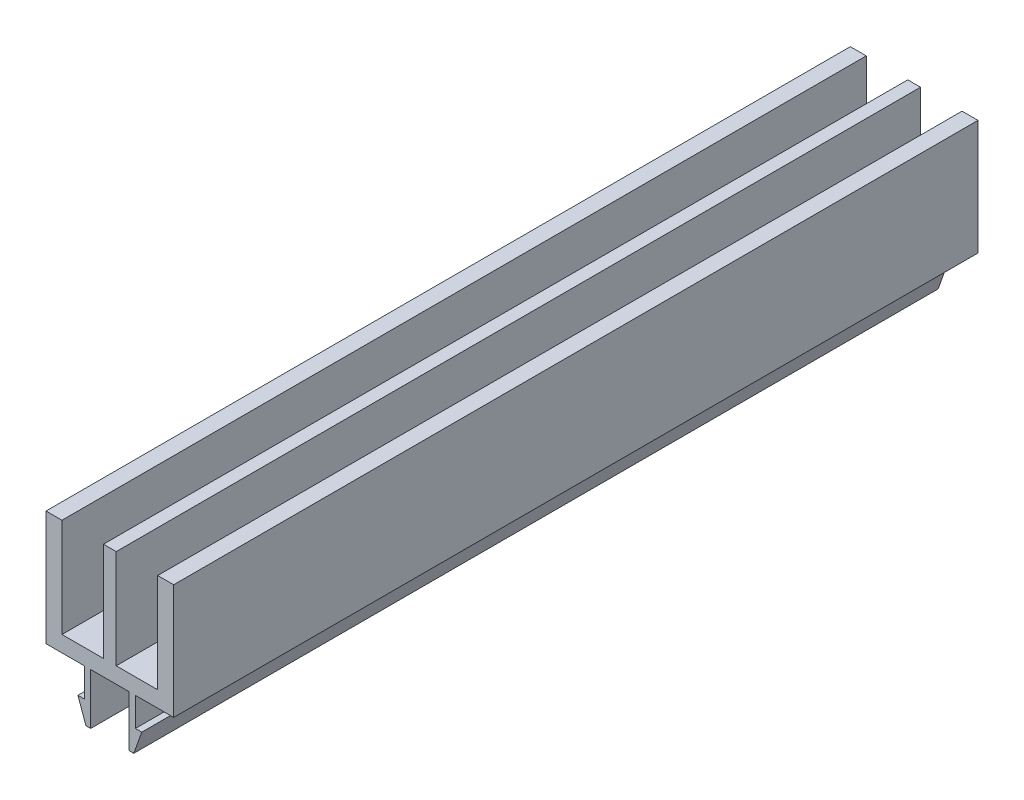
ISO-10303-21;
HEADER;
FILE_DESCRIPTION(('STEP AP214'),'2;1');
FILE_NAME('part.step','',(''),(''),'','','');
FILE_SCHEMA(('AUTOMOTIVE_DESIGN { 1 0 10303 214 1 1 1 1 }'));
ENDSEC;
DATA;
#1=APPLICATION_CONTEXT('core data for automotive mechanical design processes');
#2=APPLICATION_PROTOCOL_DEFINITION('international standard','automotive_design',2000,#1);
#3=PRODUCT_CONTEXT('',#1,'mechanical');
#4=PRODUCT('Part','Part','',(#3));
#5=PRODUCT_RELATED_PRODUCT_CATEGORY('part','',(#4));
#6=PRODUCT_DEFINITION_FORMATION('','',#4);
#7=PRODUCT_DEFINITION_CONTEXT('part definition',#1,'design');
#8=PRODUCT_DEFINITION('design','',#6,#7);
#9=PRODUCT_DEFINITION_SHAPE('','',#8);
#10=(LENGTH_UNIT() NAMED_UNIT(*) SI_UNIT(.MILLI.,.METRE.));
#11=(NAMED_UNIT(*) PLANE_ANGLE_UNIT() SI_UNIT($,.RADIAN.));
#12=(NAMED_UNIT(*) SI_UNIT($,.STERADIAN.) SOLID_ANGLE_UNIT());
#13=UNCERTAINTY_MEASURE_WITH_UNIT(LENGTH_MEASURE(1.E-05),#10,'distance_accuracy_value','');
#14=(GEOMETRIC_REPRESENTATION_CONTEXT(3) GLOBAL_UNCERTAINTY_ASSIGNED_CONTEXT((#13)) GLOBAL_UNIT_ASSIGNED_CONTEXT((#10,
#11,#12)) REPRESENTATION_CONTEXT('',''));
#15=CARTESIAN_POINT('',(0.,0.,0.));
#16=DIRECTION('',(0.,0.,1.));
#17=DIRECTION('',(1.,0.,0.));
#18=AXIS2_PLACEMENT_3D('',#15,#16,#17);
#19=CARTESIAN_POINT('',(-1.,17.9999999975,-76.));
#20=DIRECTION('',(-1.,0.,0.));
#21=DIRECTION('',(0.,-1.,0.));
#22=AXIS2_PLACEMENT_3D('',#19,#20,#21);
#23=PLANE('',#22);
#24=DIRECTION('',(0.,-1.,0.));
#25=VECTOR('',#24,1.);
#26=CARTESIAN_POINT('',(-1.,17.9999999975,50.));
#27=LINE('',#26,#25);
#28=CARTESIAN_POINT('',(-1.,17.9999999975,50.));
#29=VERTEX_POINT('',#28);
#30=CARTESIAN_POINT('',(-1.,2.4999999995,50.));
#31=VERTEX_POINT('',#30);
#32=EDGE_CURVE('E226',#29,#31,#27,.T.);
#33=ORIENTED_EDGE('',*,*,#32,.F.);
#34=DIRECTION('',(0.,0.,1.));
#35=VECTOR('',#34,1.);
#36=CARTESIAN_POINT('',(-1.,17.9999999975,-76.));
#37=LINE('',#36,#35);
#38=CARTESIAN_POINT('',(-1.,17.9999999975,-76.));
#39=VERTEX_POINT('',#38);
#40=EDGE_CURVE('E11',#39,#29,#37,.T.);
#41=ORIENTED_EDGE('',*,*,#40,.F.);
#42=DIRECTION('',(0.,-1.,0.));
#43=VECTOR('',#42,1.);
#44=CARTESIAN_POINT('',(-1.,17.9999999975,-76.));
#45=LINE('',#44,#43);
#46=CARTESIAN_POINT('',(-1.,2.4999999995,-76.));
#47=VERTEX_POINT('',#46);
#48=EDGE_CURVE('E294',#39,#47,#45,.T.);
#49=ORIENTED_EDGE('',*,*,#48,.T.);
#50=DIRECTION('',(0.,0.,1.));
#51=VECTOR('',#50,1.);
#52=CARTESIAN_POINT('',(-1.,2.4999999995,-76.));
#53=LINE('',#52,#51);
#54=EDGE_CURVE('E36',#47,#31,#53,.T.);
#55=ORIENTED_EDGE('',*,*,#54,.T.);
#56=EDGE_LOOP('',(#33,#41,#49,#55));
#57=FACE_BOUND('',#56,.T.);
#58=ADVANCED_FACE('F33',(#57),#23,.T.);
#59=CARTESIAN_POINT('',(0.999999999999998,17.9999999975,-76.));
#60=DIRECTION('',(0.,1.,0.));
#61=DIRECTION('',(0.,0.,1.));
#62=AXIS2_PLACEMENT_3D('',#59,#60,#61);
#63=PLANE('',#62);
#64=DIRECTION('',(-1.,0.,0.));
#65=VECTOR('',#64,1.);
#66=CARTESIAN_POINT('',(0.999999999999998,17.9999999975,50.));
#67=LINE('',#66,#65);
#68=CARTESIAN_POINT('',(0.999999999999998,17.9999999975,50.));
#69=VERTEX_POINT('',#68);
#70=EDGE_CURVE('E292',#69,#29,#67,.T.);
#71=ORIENTED_EDGE('',*,*,#70,.F.);
#72=DIRECTION('',(0.,0.,1.));
#73=VECTOR('',#72,1.);
#74=CARTESIAN_POINT('',(0.999999999999998,17.9999999975,-76.));
#75=LINE('',#74,#73);
#76=CARTESIAN_POINT('',(0.999999999999998,17.9999999975,-76.));
#77=VERTEX_POINT('',#76);
#78=EDGE_CURVE('E42',#77,#69,#75,.T.);
#79=ORIENTED_EDGE('',*,*,#78,.F.);
#80=DIRECTION('',(-1.,0.,0.));
#81=VECTOR('',#80,1.);
#82=CARTESIAN_POINT('',(0.999999999999998,17.9999999975,-76.));
#83=LINE('',#82,#81);
#84=EDGE_CURVE('E216',#77,#39,#83,.T.);
#85=ORIENTED_EDGE('',*,*,#84,.T.);
#86=ORIENTED_EDGE('',*,*,#40,.T.);
#87=EDGE_LOOP('',(#71,#79,#85,#86));
#88=FACE_BOUND('',#87,.T.);
#89=ADVANCED_FACE('F338',(#88),#63,.T.);
#90=CARTESIAN_POINT('',(0.999999999999998,2.4999999995,-76.));
#91=DIRECTION('',(1.,0.,0.));
#92=DIRECTION('',(0.,0.,-1.));
#93=AXIS2_PLACEMENT_3D('',#90,#91,#92);
#94=PLANE('',#93);
#95=DIRECTION('',(0.,1.,0.));
#96=VECTOR('',#95,1.);
#97=CARTESIAN_POINT('',(0.999999999999998,2.4999999995,50.));
#98=LINE('',#97,#96);
#99=CARTESIAN_POINT('',(0.999999999999998,2.4999999995,50.));
#100=VERTEX_POINT('',#99);
#101=EDGE_CURVE('E203',#100,#69,#98,.T.);
#102=ORIENTED_EDGE('',*,*,#101,.F.);
#103=DIRECTION('',(0.,0.,1.));
#104=VECTOR('',#103,1.);
#105=CARTESIAN_POINT('',(0.999999999999998,2.4999999995,-76.));
#106=LINE('',#105,#104);
#107=CARTESIAN_POINT('',(0.999999999999998,2.4999999995,-76.));
#108=VERTEX_POINT('',#107);
#109=EDGE_CURVE('E198',#108,#100,#106,.T.);
#110=ORIENTED_EDGE('',*,*,#109,.F.);
#111=DIRECTION('',(0.,1.,0.));
#112=VECTOR('',#111,1.);
#113=CARTESIAN_POINT('',(0.999999999999998,2.4999999995,-76.));
#114=LINE('',#113,#112);
#115=EDGE_CURVE('E201',#108,#77,#114,.T.);
#116=ORIENTED_EDGE('',*,*,#115,.T.);
#117=ORIENTED_EDGE('',*,*,#78,.T.);
#118=EDGE_LOOP('',(#102,#110,#116,#117));
#119=FACE_BOUND('',#118,.T.);
#120=ADVANCED_FACE('F200',(#119),#94,.T.);
#121=CARTESIAN_POINT('',(7.5,2.4999999995,-76.));
#122=DIRECTION('',(0.,1.,0.));
#123=DIRECTION('',(-1.,0.,0.));
#124=AXIS2_PLACEMENT_3D('',#121,#122,#123);
#125=PLANE('',#124);
#126=DIRECTION('',(-1.,0.,0.));
#127=VECTOR('',#126,1.);
#128=CARTESIAN_POINT('',(7.5,2.4999999995,50.));
#129=LINE('',#128,#127);
#130=CARTESIAN_POINT('',(7.5,2.4999999995,50.));
#131=VERTEX_POINT('',#130);
#132=EDGE_CURVE('E289',#131,#100,#129,.T.);
#133=ORIENTED_EDGE('',*,*,#132,.F.);
#134=DIRECTION('',(0.,0.,1.));
#135=VECTOR('',#134,1.);
#136=CARTESIAN_POINT('',(7.5,2.4999999995,-76.));
#137=LINE('',#136,#135);
#138=CARTESIAN_POINT('',(7.5,2.4999999995,-76.));
#139=VERTEX_POINT('',#138);
#140=EDGE_CURVE('E208',#139,#131,#137,.T.);
#141=ORIENTED_EDGE('',*,*,#140,.F.);
#142=DIRECTION('',(-1.,0.,0.));
#143=VECTOR('',#142,1.);
#144=CARTESIAN_POINT('',(7.5,2.4999999995,-76.));
#145=LINE('',#144,#143);
#146=EDGE_CURVE('E214',#139,#108,#145,.T.);
#147=ORIENTED_EDGE('',*,*,#146,.T.);
#148=ORIENTED_EDGE('',*,*,#109,.T.);
#149=EDGE_LOOP('',(#133,#141,#147,#148));
#150=FACE_BOUND('',#149,.T.);
#151=ADVANCED_FACE('F218',(#150),#125,.T.);
#152=CARTESIAN_POINT('',(7.5,17.9999999975,-76.));
#153=DIRECTION('',(-1.,0.,0.));
#154=DIRECTION('',(0.,-1.,0.));
#155=AXIS2_PLACEMENT_3D('',#152,#153,#154);
#156=PLANE('',#155);
#157=DIRECTION('',(0.,-1.,0.));
#158=VECTOR('',#157,1.);
#159=CARTESIAN_POINT('',(7.5,17.9999999975,50.));
#160=LINE('',#159,#158);
#161=CARTESIAN_POINT('',(7.5,17.9999999975,50.));
#162=VERTEX_POINT('',#161);
#163=EDGE_CURVE('E286',#162,#131,#160,.T.);
#164=ORIENTED_EDGE('',*,*,#163,.F.);
#165=DIRECTION('',(0.,0.,1.));
#166=VECTOR('',#165,1.);
#167=CARTESIAN_POINT('',(7.5,17.9999999975,-76.));
#168=LINE('',#167,#166);
#169=CARTESIAN_POINT('',(7.5,17.9999999975,-76.));
#170=VERTEX_POINT('',#169);
#171=EDGE_CURVE('E298',#170,#162,#168,.T.);
#172=ORIENTED_EDGE('',*,*,#171,.F.);
#173=DIRECTION('',(0.,-1.,0.));
#174=VECTOR('',#173,1.);
#175=CARTESIAN_POINT('',(7.5,17.9999999975,-76.));
#176=LINE('',#175,#174);
#177=EDGE_CURVE('E219',#170,#139,#176,.T.);
#178=ORIENTED_EDGE('',*,*,#177,.T.);
#179=ORIENTED_EDGE('',*,*,#140,.T.);
#180=EDGE_LOOP('',(#164,#172,#178,#179));
#181=FACE_BOUND('',#180,.T.);
#182=ADVANCED_FACE('F351',(#181),#156,.T.);
#183=CARTESIAN_POINT('',(10.,17.9999999975,-76.));
#184=DIRECTION('',(0.,1.,0.));
#185=DIRECTION('',(0.,0.,1.));
#186=AXIS2_PLACEMENT_3D('',#183,#184,#185);
#187=PLANE('',#186);
#188=DIRECTION('',(-1.,0.,0.));
#189=VECTOR('',#188,1.);
#190=CARTESIAN_POINT('',(10.,17.9999999975,50.));
#191=LINE('',#190,#189);
#192=CARTESIAN_POINT('',(10.,17.9999999975,50.));
#193=VERTEX_POINT('',#192);
#194=EDGE_CURVE('E283',#193,#162,#191,.T.);
#195=ORIENTED_EDGE('',*,*,#194,.F.);
#196=DIRECTION('',(0.,0.,1.));
#197=VECTOR('',#196,1.);
#198=CARTESIAN_POINT('',(10.,17.9999999975,-76.));
#199=LINE('',#198,#197);
#200=CARTESIAN_POINT('',(10.,17.9999999975,-76.));
#201=VERTEX_POINT('',#200);
#202=EDGE_CURVE('E300',#201,#193,#199,.T.);
#203=ORIENTED_EDGE('',*,*,#202,.F.);
#204=DIRECTION('',(-1.,0.,0.));
#205=VECTOR('',#204,1.);
#206=CARTESIAN_POINT('',(10.,17.9999999975,-76.));
#207=LINE('',#206,#205);
#208=EDGE_CURVE('E221',#201,#170,#207,.T.);
#209=ORIENTED_EDGE('',*,*,#208,.T.);
#210=ORIENTED_EDGE('',*,*,#171,.T.);
#211=EDGE_LOOP('',(#195,#203,#209,#210));
#212=FACE_BOUND('',#211,.T.);
#213=ADVANCED_FACE('F354',(#212),#187,.T.);
#214=CARTESIAN_POINT('',(10.,-4.99999828349541E-10,-76.));
#215=DIRECTION('',(1.,0.,0.));
#216=DIRECTION('',(0.,0.,-1.));
#217=AXIS2_PLACEMENT_3D('',#214,#215,#216);
#218=PLANE('',#217);
#219=DIRECTION('',(0.,1.,0.));
#220=VECTOR('',#219,1.);
#221=CARTESIAN_POINT('',(10.,-4.99999828349541E-10,50.));
#222=LINE('',#221,#220);
#223=CARTESIAN_POINT('',(10.,-4.99999828349541E-10,50.));
#224=VERTEX_POINT('',#223);
#225=EDGE_CURVE('E280',#224,#193,#222,.T.);
#226=ORIENTED_EDGE('',*,*,#225,.F.);
#227=DIRECTION('',(0.,0.,1.));
#228=VECTOR('',#227,1.);
#229=CARTESIAN_POINT('',(10.,-4.99999828349541E-10,-76.));
#230=LINE('',#229,#228);
#231=CARTESIAN_POINT('',(10.,-4.99999828349541E-10,-76.));
#232=VERTEX_POINT('',#231);
#233=EDGE_CURVE('E302',#232,#224,#230,.T.);
#234=ORIENTED_EDGE('',*,*,#233,.F.);
#235=DIRECTION('',(0.,1.,0.));
#236=VECTOR('',#235,1.);
#237=CARTESIAN_POINT('',(10.,-4.99999828349541E-10,-76.));
#238=LINE('',#237,#236);
#239=EDGE_CURVE('E644',#232,#201,#238,.T.);
#240=ORIENTED_EDGE('',*,*,#239,.T.);
#241=ORIENTED_EDGE('',*,*,#202,.T.);
#242=EDGE_LOOP('',(#226,#234,#240,#241));
#243=FACE_BOUND('',#242,.T.);
#244=ADVANCED_FACE('F358',(#243),#218,.T.);
#245=CARTESIAN_POINT('',(4.,-4.99999998002099E-10,-76.));
#246=DIRECTION('',(0.,-1.,0.));
#247=DIRECTION('',(1.,0.,0.));
#248=AXIS2_PLACEMENT_3D('',#245,#246,#247);
#249=PLANE('',#248);
#250=DIRECTION('',(1.,0.,0.));
#251=VECTOR('',#250,1.);
#252=CARTESIAN_POINT('',(4.,-4.99999998002099E-10,50.));
#253=LINE('',#252,#251);
#254=CARTESIAN_POINT('',(4.,-4.99999998002099E-10,50.));
#255=VERTEX_POINT('',#254);
#256=EDGE_CURVE('E277',#255,#224,#253,.T.);
#257=ORIENTED_EDGE('',*,*,#256,.F.);
#258=DIRECTION('',(0.,0.,1.));
#259=VECTOR('',#258,1.);
#260=CARTESIAN_POINT('',(4.,-4.99999998002099E-10,-76.));
#261=LINE('',#260,#259);
#262=CARTESIAN_POINT('',(4.,-4.99999998002099E-10,-76.));
#263=VERTEX_POINT('',#262);
#264=EDGE_CURVE('E304',#263,#255,#261,.T.);
#265=ORIENTED_EDGE('',*,*,#264,.F.);
#266=DIRECTION('',(1.,0.,0.));
#267=VECTOR('',#266,1.);
#268=CARTESIAN_POINT('',(4.,-4.99999998002099E-10,-76.));
#269=LINE('',#268,#267);
#270=EDGE_CURVE('E648',#263,#232,#269,.T.);
#271=ORIENTED_EDGE('',*,*,#270,.T.);
#272=ORIENTED_EDGE('',*,*,#233,.T.);
#273=EDGE_LOOP('',(#257,#265,#271,#272));
#274=FACE_BOUND('',#273,.T.);
#275=ADVANCED_FACE('F362',(#274),#249,.T.);
#276=CARTESIAN_POINT('',(4.,-4.5,-76.));
#277=DIRECTION('',(1.,0.,0.));
#278=DIRECTION('',(0.,0.,-1.));
#279=AXIS2_PLACEMENT_3D('',#276,#277,#278);
#280=PLANE('',#279);
#281=DIRECTION('',(0.,1.,0.));
#282=VECTOR('',#281,1.);
#283=CARTESIAN_POINT('',(4.,-4.5,50.));
#284=LINE('',#283,#282);
#285=CARTESIAN_POINT('',(4.,-4.5,50.));
#286=VERTEX_POINT('',#285);
#287=EDGE_CURVE('E274',#286,#255,#284,.T.);
#288=ORIENTED_EDGE('',*,*,#287,.F.);
#289=DIRECTION('',(0.,0.,1.));
#290=VECTOR('',#289,1.);
#291=CARTESIAN_POINT('',(4.,-4.5,-76.));
#292=LINE('',#291,#290);
#293=CARTESIAN_POINT('',(4.,-4.5,-76.));
#294=VERTEX_POINT('',#293);
#295=EDGE_CURVE('E306',#294,#286,#292,.T.);
#296=ORIENTED_EDGE('',*,*,#295,.F.);
#297=DIRECTION('',(0.,1.,0.));
#298=VECTOR('',#297,1.);
#299=CARTESIAN_POINT('',(4.,-4.5,-76.));
#300=LINE('',#299,#298);
#301=EDGE_CURVE('E637',#294,#263,#300,.T.);
#302=ORIENTED_EDGE('',*,*,#301,.T.);
#303=ORIENTED_EDGE('',*,*,#264,.T.);
#304=EDGE_LOOP('',(#288,#296,#302,#303));
#305=FACE_BOUND('',#304,.T.);
#306=ADVANCED_FACE('F366',(#305),#280,.T.);
#307=CARTESIAN_POINT('',(5.,-4.5,-76.));
#308=DIRECTION('',(0.,1.,0.));
#309=DIRECTION('',(0.,0.,1.));
#310=AXIS2_PLACEMENT_3D('',#307,#308,#309);
#311=PLANE('',#310);
#312=DIRECTION('',(-1.,0.,0.));
#313=VECTOR('',#312,1.);
#314=CARTESIAN_POINT('',(5.,-4.5,50.));
#315=LINE('',#314,#313);
#316=CARTESIAN_POINT('',(5.,-4.5,50.));
#317=VERTEX_POINT('',#316);
#318=EDGE_CURVE('E271',#317,#286,#315,.T.);
#319=ORIENTED_EDGE('',*,*,#318,.F.);
#320=DIRECTION('',(0.,0.,1.));
#321=VECTOR('',#320,1.);
#322=CARTESIAN_POINT('',(5.,-4.5,-76.));
#323=LINE('',#322,#321);
#324=CARTESIAN_POINT('',(5.,-4.5,-76.));
#325=VERTEX_POINT('',#324);
#326=EDGE_CURVE('E308',#325,#317,#323,.T.);
#327=ORIENTED_EDGE('',*,*,#326,.F.);
#328=DIRECTION('',(-1.,0.,0.));
#329=VECTOR('',#328,1.);
#330=CARTESIAN_POINT('',(5.,-4.5,-76.));
#331=LINE('',#330,#329);
#332=EDGE_CURVE('E633',#325,#294,#331,.T.);
#333=ORIENTED_EDGE('',*,*,#332,.T.);
#334=ORIENTED_EDGE('',*,*,#295,.T.);
#335=EDGE_LOOP('',(#319,#327,#333,#334));
#336=FACE_BOUND('',#335,.T.);
#337=ADVANCED_FACE('F370',(#336),#311,.T.);
#338=CARTESIAN_POINT('',(3.75,-8.,-76.));
#339=DIRECTION('',(0.941741911594837,-0.336336396998157,0.));
#340=DIRECTION('',(0.336336396998157,0.941741911594837,0.));
#341=AXIS2_PLACEMENT_3D('',#338,#339,#340);
#342=PLANE('',#341);
#343=DIRECTION('',(0.336336396998157,0.941741911594837,0.));
#344=VECTOR('',#343,1.);
#345=CARTESIAN_POINT('',(3.75,-8.,50.));
#346=LINE('',#345,#344);
#347=CARTESIAN_POINT('',(3.75,-8.,50.));
#348=VERTEX_POINT('',#347);
#349=EDGE_CURVE('E268',#348,#317,#346,.T.);
#350=ORIENTED_EDGE('',*,*,#349,.F.);
#351=DIRECTION('',(0.,0.,1.));
#352=VECTOR('',#351,1.);
#353=CARTESIAN_POINT('',(3.75,-8.,-76.));
#354=LINE('',#353,#352);
#355=CARTESIAN_POINT('',(3.75,-8.,-76.));
#356=VERTEX_POINT('',#355);
#357=EDGE_CURVE('E310',#356,#348,#354,.T.);
#358=ORIENTED_EDGE('',*,*,#357,.F.);
#359=DIRECTION('',(0.336336396998157,0.941741911594837,0.));
#360=VECTOR('',#359,1.);
#361=CARTESIAN_POINT('',(3.75,-8.,-76.));
#362=LINE('',#361,#360);
#363=EDGE_CURVE('E654',#356,#325,#362,.T.);
#364=ORIENTED_EDGE('',*,*,#363,.T.);
#365=ORIENTED_EDGE('',*,*,#326,.T.);
#366=EDGE_LOOP('',(#350,#358,#364,#365));
#367=FACE_BOUND('',#366,.T.);
#368=ADVANCED_FACE('F374',(#367),#342,.T.);
#369=CARTESIAN_POINT('',(3.,-8.,-76.));
#370=DIRECTION('',(0.,-1.,0.));
#371=DIRECTION('',(0.,0.,-1.));
#372=AXIS2_PLACEMENT_3D('',#369,#370,#371);
#373=PLANE('',#372);
#374=DIRECTION('',(1.,0.,0.));
#375=VECTOR('',#374,1.);
#376=CARTESIAN_POINT('',(3.,-8.,50.));
#377=LINE('',#376,#375);
#378=CARTESIAN_POINT('',(3.,-8.,50.));
#379=VERTEX_POINT('',#378);
#380=EDGE_CURVE('E265',#379,#348,#377,.T.);
#381=ORIENTED_EDGE('',*,*,#380,.F.);
#382=DIRECTION('',(0.,0.,1.));
#383=VECTOR('',#382,1.);
#384=CARTESIAN_POINT('',(3.,-8.,-76.));
#385=LINE('',#384,#383);
#386=CARTESIAN_POINT('',(3.,-8.,-76.));
#387=VERTEX_POINT('',#386);
#388=EDGE_CURVE('E312',#387,#379,#385,.T.);
#389=ORIENTED_EDGE('',*,*,#388,.F.);
#390=DIRECTION('',(1.,0.,0.));
#391=VECTOR('',#390,1.);
#392=CARTESIAN_POINT('',(3.,-8.,-76.));
#393=LINE('',#392,#391);
#394=EDGE_CURVE('E626',#387,#356,#393,.T.);
#395=ORIENTED_EDGE('',*,*,#394,.T.);
#396=ORIENTED_EDGE('',*,*,#357,.T.);
#397=EDGE_LOOP('',(#381,#389,#395,#396));
#398=FACE_BOUND('',#397,.T.);
#399=ADVANCED_FACE('F378',(#398),#373,.T.);
#400=CARTESIAN_POINT('',(3.,-4.9999985194348E-10,-76.));
#401=DIRECTION('',(-1.,0.,0.));
#402=DIRECTION('',(0.,0.,1.));
#403=AXIS2_PLACEMENT_3D('',#400,#401,#402);
#404=PLANE('',#403);
#405=DIRECTION('',(0.,-1.,0.));
#406=VECTOR('',#405,1.);
#407=CARTESIAN_POINT('',(3.,-4.9999985194348E-10,50.));
#408=LINE('',#407,#406);
#409=CARTESIAN_POINT('',(3.,-4.9999985194348E-10,50.));
#410=VERTEX_POINT('',#409);
#411=EDGE_CURVE('E262',#410,#379,#408,.T.);
#412=ORIENTED_EDGE('',*,*,#411,.F.);
#413=DIRECTION('',(0.,0.,1.));
#414=VECTOR('',#413,1.);
#415=CARTESIAN_POINT('',(3.,-4.9999985194348E-10,-76.));
#416=LINE('',#415,#414);
#417=CARTESIAN_POINT('',(3.,-4.9999985194348E-10,-76.));
#418=VERTEX_POINT('',#417);
#419=EDGE_CURVE('E314',#418,#410,#416,.T.);
#420=ORIENTED_EDGE('',*,*,#419,.F.);
#421=DIRECTION('',(0.,-1.,0.));
#422=VECTOR('',#421,1.);
#423=CARTESIAN_POINT('',(3.,-4.9999985194348E-10,-76.));
#424=LINE('',#423,#422);
#425=EDGE_CURVE('E622',#418,#387,#424,.T.);
#426=ORIENTED_EDGE('',*,*,#425,.T.);
#427=ORIENTED_EDGE('',*,*,#388,.T.);
#428=EDGE_LOOP('',(#412,#420,#426,#427));
#429=FACE_BOUND('',#428,.T.);
#430=ADVANCED_FACE('F382',(#429),#404,.T.);
#431=CARTESIAN_POINT('',(-3.,-4.99999455901012E-10,-76.));
#432=DIRECTION('',(0.,-1.,0.));
#433=DIRECTION('',(1.,0.,0.));
#434=AXIS2_PLACEMENT_3D('',#431,#432,#433);
#435=PLANE('',#434);
#436=DIRECTION('',(1.,0.,0.));
#437=VECTOR('',#436,1.);
#438=CARTESIAN_POINT('',(-3.,-4.99999455901012E-10,50.));
#439=LINE('',#438,#437);
#440=CARTESIAN_POINT('',(-3.,-4.99999455901012E-10,50.));
#441=VERTEX_POINT('',#440);
#442=EDGE_CURVE('E259',#441,#410,#439,.T.);
#443=ORIENTED_EDGE('',*,*,#442,.F.);
#444=DIRECTION('',(0.,0.,1.));
#445=VECTOR('',#444,1.);
#446=CARTESIAN_POINT('',(-3.,-4.99999455901012E-10,-76.));
#447=LINE('',#446,#445);
#448=CARTESIAN_POINT('',(-3.,-4.99999455901012E-10,-76.));
#449=VERTEX_POINT('',#448);
#450=EDGE_CURVE('E316',#449,#441,#447,.T.);
#451=ORIENTED_EDGE('',*,*,#450,.F.);
#452=DIRECTION('',(1.,0.,0.));
#453=VECTOR('',#452,1.);
#454=CARTESIAN_POINT('',(-3.,-4.99999455901012E-10,-76.));
#455=LINE('',#454,#453);
#456=EDGE_CURVE('E658',#449,#418,#455,.T.);
#457=ORIENTED_EDGE('',*,*,#456,.T.);
#458=ORIENTED_EDGE('',*,*,#419,.T.);
#459=EDGE_LOOP('',(#443,#451,#457,#458));
#460=FACE_BOUND('',#459,.T.);
#461=ADVANCED_FACE('F386',(#460),#435,.T.);
#462=CARTESIAN_POINT('',(-3.,-8.,-76.));
#463=DIRECTION('',(1.,0.,0.));
#464=DIRECTION('',(0.,0.,-1.));
#465=AXIS2_PLACEMENT_3D('',#462,#463,#464);
#466=PLANE('',#465);
#467=DIRECTION('',(0.,1.,0.));
#468=VECTOR('',#467,1.);
#469=CARTESIAN_POINT('',(-3.,-8.,50.));
#470=LINE('',#469,#468);
#471=CARTESIAN_POINT('',(-3.,-8.,50.));
#472=VERTEX_POINT('',#471);
#473=EDGE_CURVE('E256',#472,#441,#470,.T.);
#474=ORIENTED_EDGE('',*,*,#473,.F.);
#475=DIRECTION('',(0.,0.,1.));
#476=VECTOR('',#475,1.);
#477=CARTESIAN_POINT('',(-3.,-8.,-76.));
#478=LINE('',#477,#476);
#479=CARTESIAN_POINT('',(-3.,-8.,-76.));
#480=VERTEX_POINT('',#479);
#481=EDGE_CURVE('E318',#480,#472,#478,.T.);
#482=ORIENTED_EDGE('',*,*,#481,.F.);
#483=DIRECTION('',(0.,1.,0.));
#484=VECTOR('',#483,1.);
#485=CARTESIAN_POINT('',(-3.,-8.,-76.));
#486=LINE('',#485,#484);
#487=EDGE_CURVE('E615',#480,#449,#486,.T.);
#488=ORIENTED_EDGE('',*,*,#487,.T.);
#489=ORIENTED_EDGE('',*,*,#450,.T.);
#490=EDGE_LOOP('',(#474,#482,#488,#489));
#491=FACE_BOUND('',#490,.T.);
#492=ADVANCED_FACE('F390',(#491),#466,.T.);
#493=CARTESIAN_POINT('',(-3.75,-8.,-76.));
#494=DIRECTION('',(0.,-1.,0.));
#495=DIRECTION('',(0.,0.,-1.));
#496=AXIS2_PLACEMENT_3D('',#493,#494,#495);
#497=PLANE('',#496);
#498=DIRECTION('',(1.,0.,0.));
#499=VECTOR('',#498,1.);
#500=CARTESIAN_POINT('',(-3.75,-8.,50.));
#501=LINE('',#500,#499);
#502=CARTESIAN_POINT('',(-3.75,-8.,50.));
#503=VERTEX_POINT('',#502);
#504=EDGE_CURVE('E253',#503,#472,#501,.T.);
#505=ORIENTED_EDGE('',*,*,#504,.F.);
#506=DIRECTION('',(0.,0.,1.));
#507=VECTOR('',#506,1.);
#508=CARTESIAN_POINT('',(-3.75,-8.,-76.));
#509=LINE('',#508,#507);
#510=CARTESIAN_POINT('',(-3.75,-8.,-76.));
#511=VERTEX_POINT('',#510);
#512=EDGE_CURVE('E320',#511,#503,#509,.T.);
#513=ORIENTED_EDGE('',*,*,#512,.F.);
#514=DIRECTION('',(1.,0.,0.));
#515=VECTOR('',#514,1.);
#516=CARTESIAN_POINT('',(-3.75,-8.,-76.));
#517=LINE('',#516,#515);
#518=EDGE_CURVE('E611',#511,#480,#517,.T.);
#519=ORIENTED_EDGE('',*,*,#518,.T.);
#520=ORIENTED_EDGE('',*,*,#481,.T.);
#521=EDGE_LOOP('',(#505,#513,#519,#520));
#522=FACE_BOUND('',#521,.T.);
#523=ADVANCED_FACE('F394',(#522),#497,.T.);
#524=CARTESIAN_POINT('',(-5.,-4.5,-76.));
#525=DIRECTION('',(-0.941741911594837,-0.336336396998156,0.));
#526=DIRECTION('',(0.336336396998156,-0.941741911594838,0.));
#527=AXIS2_PLACEMENT_3D('',#524,#525,#526);
#528=PLANE('',#527);
#529=DIRECTION('',(0.336336396998156,-0.941741911594837,0.));
#530=VECTOR('',#529,1.);
#531=CARTESIAN_POINT('',(-5.,-4.5,50.));
#532=LINE('',#531,#530);
#533=CARTESIAN_POINT('',(-5.,-4.5,50.));
#534=VERTEX_POINT('',#533);
#535=EDGE_CURVE('E250',#534,#503,#532,.T.);
#536=ORIENTED_EDGE('',*,*,#535,.F.);
#537=DIRECTION('',(0.,0.,1.));
#538=VECTOR('',#537,1.);
#539=CARTESIAN_POINT('',(-5.,-4.5,-76.));
#540=LINE('',#539,#538);
#541=CARTESIAN_POINT('',(-5.,-4.5,-76.));
#542=VERTEX_POINT('',#541);
#543=EDGE_CURVE('E322',#542,#534,#540,.T.);
#544=ORIENTED_EDGE('',*,*,#543,.F.);
#545=DIRECTION('',(0.336336396998156,-0.941741911594837,0.));
#546=VECTOR('',#545,1.);
#547=CARTESIAN_POINT('',(-5.,-4.5,-76.));
#548=LINE('',#547,#546);
#549=EDGE_CURVE('E662',#542,#511,#548,.T.);
#550=ORIENTED_EDGE('',*,*,#549,.T.);
#551=ORIENTED_EDGE('',*,*,#512,.T.);
#552=EDGE_LOOP('',(#536,#544,#550,#551));
#553=FACE_BOUND('',#552,.T.);
#554=ADVANCED_FACE('F398',(#553),#528,.T.);
#555=CARTESIAN_POINT('',(-4.,-4.5,-76.));
#556=DIRECTION('',(0.,1.,0.));
#557=DIRECTION('',(0.,0.,1.));
#558=AXIS2_PLACEMENT_3D('',#555,#556,#557);
#559=PLANE('',#558);
#560=DIRECTION('',(-1.,0.,0.));
#561=VECTOR('',#560,1.);
#562=CARTESIAN_POINT('',(-4.,-4.5,50.));
#563=LINE('',#562,#561);
#564=CARTESIAN_POINT('',(-4.,-4.5,50.));
#565=VERTEX_POINT('',#564);
#566=EDGE_CURVE('E247',#565,#534,#563,.T.);
#567=ORIENTED_EDGE('',*,*,#566,.F.);
#568=DIRECTION('',(0.,0.,1.));
#569=VECTOR('',#568,1.);
#570=CARTESIAN_POINT('',(-4.,-4.5,-76.));
#571=LINE('',#570,#569);
#572=CARTESIAN_POINT('',(-4.,-4.5,-76.));
#573=VERTEX_POINT('',#572);
#574=EDGE_CURVE('E324',#573,#565,#571,.T.);
#575=ORIENTED_EDGE('',*,*,#574,.F.);
#576=DIRECTION('',(-1.,0.,0.));
#577=VECTOR('',#576,1.);
#578=CARTESIAN_POINT('',(-4.,-4.5,-76.));
#579=LINE('',#578,#577);
#580=EDGE_CURVE('E604',#573,#542,#579,.T.);
#581=ORIENTED_EDGE('',*,*,#580,.T.);
#582=ORIENTED_EDGE('',*,*,#543,.T.);
#583=EDGE_LOOP('',(#567,#575,#581,#582));
#584=FACE_BOUND('',#583,.T.);
#585=ADVANCED_FACE('F402',(#584),#559,.T.);
#586=CARTESIAN_POINT('',(-4.,-4.9999985194348E-10,-76.));
#587=DIRECTION('',(-1.,0.,0.));
#588=DIRECTION('',(0.,0.,1.));
#589=AXIS2_PLACEMENT_3D('',#586,#587,#588);
#590=PLANE('',#589);
#591=DIRECTION('',(0.,-1.,0.));
#592=VECTOR('',#591,1.);
#593=CARTESIAN_POINT('',(-4.,-4.9999985194348E-10,50.));
#594=LINE('',#593,#592);
#595=CARTESIAN_POINT('',(-4.,-4.9999985194348E-10,50.));
#596=VERTEX_POINT('',#595);
#597=EDGE_CURVE('E244',#596,#565,#594,.T.);
#598=ORIENTED_EDGE('',*,*,#597,.F.);
#599=DIRECTION('',(0.,0.,1.));
#600=VECTOR('',#599,1.);
#601=CARTESIAN_POINT('',(-4.,-4.9999985194348E-10,-76.));
#602=LINE('',#601,#600);
#603=CARTESIAN_POINT('',(-4.,-4.9999985194348E-10,-76.));
#604=VERTEX_POINT('',#603);
#605=EDGE_CURVE('E326',#604,#596,#602,.T.);
#606=ORIENTED_EDGE('',*,*,#605,.F.);
#607=DIRECTION('',(0.,-1.,0.));
#608=VECTOR('',#607,1.);
#609=CARTESIAN_POINT('',(-4.,-4.9999985194348E-10,-76.));
#610=LINE('',#609,#608);
#611=EDGE_CURVE('E600',#604,#573,#610,.T.);
#612=ORIENTED_EDGE('',*,*,#611,.T.);
#613=ORIENTED_EDGE('',*,*,#574,.T.);
#614=EDGE_LOOP('',(#598,#606,#612,#613));
#615=FACE_BOUND('',#614,.T.);
#616=ADVANCED_FACE('F406',(#615),#590,.T.);
#617=CARTESIAN_POINT('',(-10.,-4.99999719929324E-10,-76.));
#618=DIRECTION('',(0.,-1.,0.));
#619=DIRECTION('',(1.,0.,0.));
#620=AXIS2_PLACEMENT_3D('',#617,#618,#619);
#621=PLANE('',#620);
#622=DIRECTION('',(1.,0.,0.));
#623=VECTOR('',#622,1.);
#624=CARTESIAN_POINT('',(-10.,-4.99999719929324E-10,50.));
#625=LINE('',#624,#623);
#626=CARTESIAN_POINT('',(-10.,-4.99999719929324E-10,50.));
#627=VERTEX_POINT('',#626);
#628=EDGE_CURVE('E241',#627,#596,#625,.T.);
#629=ORIENTED_EDGE('',*,*,#628,.F.);
#630=DIRECTION('',(0.,0.,1.));
#631=VECTOR('',#630,1.);
#632=CARTESIAN_POINT('',(-10.,-4.99999719929324E-10,-76.));
#633=LINE('',#632,#631);
#634=CARTESIAN_POINT('',(-10.,-4.99999719929324E-10,-76.));
#635=VERTEX_POINT('',#634);
#636=EDGE_CURVE('E328',#635,#627,#633,.T.);
#637=ORIENTED_EDGE('',*,*,#636,.F.);
#638=DIRECTION('',(1.,0.,0.));
#639=VECTOR('',#638,1.);
#640=CARTESIAN_POINT('',(-10.,-4.99999719929324E-10,-76.));
#641=LINE('',#640,#639);
#642=EDGE_CURVE('E666',#635,#604,#641,.T.);
#643=ORIENTED_EDGE('',*,*,#642,.T.);
#644=ORIENTED_EDGE('',*,*,#605,.T.);
#645=EDGE_LOOP('',(#629,#637,#643,#644));
#646=FACE_BOUND('',#645,.T.);
#647=ADVANCED_FACE('F410',(#646),#621,.T.);
#648=CARTESIAN_POINT('',(-10.,17.9999999975,-76.));
#649=DIRECTION('',(-1.,0.,0.));
#650=DIRECTION('',(0.,-1.,0.));
#651=AXIS2_PLACEMENT_3D('',#648,#649,#650);
#652=PLANE('',#651);
#653=DIRECTION('',(0.,-1.,0.));
#654=VECTOR('',#653,1.);
#655=CARTESIAN_POINT('',(-10.,17.9999999975,50.));
#656=LINE('',#655,#654);
#657=CARTESIAN_POINT('',(-10.,17.9999999975,50.));
#658=VERTEX_POINT('',#657);
#659=EDGE_CURVE('E238',#658,#627,#656,.T.);
#660=ORIENTED_EDGE('',*,*,#659,.F.);
#661=DIRECTION('',(0.,0.,1.));
#662=VECTOR('',#661,1.);
#663=CARTESIAN_POINT('',(-10.,17.9999999975,-76.));
#664=LINE('',#663,#662);
#665=CARTESIAN_POINT('',(-10.,17.9999999975,-76.));
#666=VERTEX_POINT('',#665);
#667=EDGE_CURVE('E330',#666,#658,#664,.T.);
#668=ORIENTED_EDGE('',*,*,#667,.F.);
#669=DIRECTION('',(0.,-1.,0.));
#670=VECTOR('',#669,1.);
#671=CARTESIAN_POINT('',(-10.,17.9999999975,-76.));
#672=LINE('',#671,#670);
#673=EDGE_CURVE('E593',#666,#635,#672,.T.);
#674=ORIENTED_EDGE('',*,*,#673,.T.);
#675=ORIENTED_EDGE('',*,*,#636,.T.);
#676=EDGE_LOOP('',(#660,#668,#674,#675));
#677=FACE_BOUND('',#676,.T.);
#678=ADVANCED_FACE('F414',(#677),#652,.T.);
#679=CARTESIAN_POINT('',(-7.5,17.9999999975,-76.));
#680=DIRECTION('',(0.,1.,0.));
#681=DIRECTION('',(0.,0.,1.));
#682=AXIS2_PLACEMENT_3D('',#679,#680,#681);
#683=PLANE('',#682);
#684=DIRECTION('',(-1.,0.,0.));
#685=VECTOR('',#684,1.);
#686=CARTESIAN_POINT('',(-7.5,17.9999999975,50.));
#687=LINE('',#686,#685);
#688=CARTESIAN_POINT('',(-7.5,17.9999999975,50.));
#689=VERTEX_POINT('',#688);
#690=EDGE_CURVE('E235',#689,#658,#687,.T.);
#691=ORIENTED_EDGE('',*,*,#690,.F.);
#692=DIRECTION('',(0.,0.,1.));
#693=VECTOR('',#692,1.);
#694=CARTESIAN_POINT('',(-7.5,17.9999999975,-76.));
#695=LINE('',#694,#693);
#696=CARTESIAN_POINT('',(-7.5,17.9999999975,-76.));
#697=VERTEX_POINT('',#696);
#698=EDGE_CURVE('E332',#697,#689,#695,.T.);
#699=ORIENTED_EDGE('',*,*,#698,.F.);
#700=DIRECTION('',(-1.,0.,0.));
#701=VECTOR('',#700,1.);
#702=CARTESIAN_POINT('',(-7.5,17.9999999975,-76.));
#703=LINE('',#702,#701);
#704=EDGE_CURVE('E589',#697,#666,#703,.T.);
#705=ORIENTED_EDGE('',*,*,#704,.T.);
#706=ORIENTED_EDGE('',*,*,#667,.T.);
#707=EDGE_LOOP('',(#691,#699,#705,#706));
#708=FACE_BOUND('',#707,.T.);
#709=ADVANCED_FACE('F418',(#708),#683,.T.);
#710=CARTESIAN_POINT('',(-7.5,2.4999999995,-76.));
#711=DIRECTION('',(1.,0.,0.));
#712=DIRECTION('',(0.,0.,-1.));
#713=AXIS2_PLACEMENT_3D('',#710,#711,#712);
#714=PLANE('',#713);
#715=DIRECTION('',(0.,1.,0.));
#716=VECTOR('',#715,1.);
#717=CARTESIAN_POINT('',(-7.5,2.4999999995,50.));
#718=LINE('',#717,#716);
#719=CARTESIAN_POINT('',(-7.5,2.4999999995,50.));
#720=VERTEX_POINT('',#719);
#721=EDGE_CURVE('E232',#720,#689,#718,.T.);
#722=ORIENTED_EDGE('',*,*,#721,.F.);
#723=DIRECTION('',(0.,0.,1.));
#724=VECTOR('',#723,1.);
#725=CARTESIAN_POINT('',(-7.5,2.4999999995,-76.));
#726=LINE('',#725,#724);
#727=CARTESIAN_POINT('',(-7.5,2.4999999995,-76.));
#728=VERTEX_POINT('',#727);
#729=EDGE_CURVE('E333',#728,#720,#726,.T.);
#730=ORIENTED_EDGE('',*,*,#729,.F.);
#731=DIRECTION('',(0.,1.,0.));
#732=VECTOR('',#731,1.);
#733=CARTESIAN_POINT('',(-7.5,2.4999999995,-76.));
#734=LINE('',#733,#732);
#735=EDGE_CURVE('E670',#728,#697,#734,.T.);
#736=ORIENTED_EDGE('',*,*,#735,.T.);
#737=ORIENTED_EDGE('',*,*,#698,.T.);
#738=EDGE_LOOP('',(#722,#730,#736,#737));
#739=FACE_BOUND('',#738,.T.);
#740=ADVANCED_FACE('F422',(#739),#714,.T.);
#741=CARTESIAN_POINT('',(-1.,2.4999999995,-76.));
#742=DIRECTION('',(0.,1.,0.));
#743=DIRECTION('',(-1.,0.,0.));
#744=AXIS2_PLACEMENT_3D('',#741,#742,#743);
#745=PLANE('',#744);
#746=DIRECTION('',(-1.,0.,0.));
#747=VECTOR('',#746,1.);
#748=CARTESIAN_POINT('',(-1.,2.4999999995,50.));
#749=LINE('',#748,#747);
#750=EDGE_CURVE('E229',#31,#720,#749,.T.);
#751=ORIENTED_EDGE('',*,*,#750,.F.);
#752=ORIENTED_EDGE('',*,*,#54,.F.);
#753=DIRECTION('',(-1.,0.,0.));
#754=VECTOR('',#753,1.);
#755=CARTESIAN_POINT('',(-1.,2.4999999995,-76.));
#756=LINE('',#755,#754);
#757=EDGE_CURVE('E672',#47,#728,#756,.T.);
#758=ORIENTED_EDGE('',*,*,#757,.T.);
#759=ORIENTED_EDGE('',*,*,#729,.T.);
#760=EDGE_LOOP('',(#751,#752,#758,#759));
#761=FACE_BOUND('',#760,.T.);
#762=ADVANCED_FACE('F335',(#761),#745,.T.);
#763=CARTESIAN_POINT('',(0.,0.,-76.));
#764=DIRECTION('',(0.,0.,-1.));
#765=DIRECTION('',(-1.,0.,0.));
#766=AXIS2_PLACEMENT_3D('',#763,#764,#765);
#767=PLANE('',#766);
#768=ORIENTED_EDGE('',*,*,#48,.F.);
#769=ORIENTED_EDGE('',*,*,#84,.F.);
#770=ORIENTED_EDGE('',*,*,#115,.F.);
#771=ORIENTED_EDGE('',*,*,#146,.F.);
#772=ORIENTED_EDGE('',*,*,#177,.F.);
#773=ORIENTED_EDGE('',*,*,#208,.F.);
#774=ORIENTED_EDGE('',*,*,#239,.F.);
#775=ORIENTED_EDGE('',*,*,#270,.F.);
#776=ORIENTED_EDGE('',*,*,#301,.F.);
#777=ORIENTED_EDGE('',*,*,#332,.F.);
#778=ORIENTED_EDGE('',*,*,#363,.F.);
#779=ORIENTED_EDGE('',*,*,#394,.F.);
#780=ORIENTED_EDGE('',*,*,#425,.F.);
#781=ORIENTED_EDGE('',*,*,#456,.F.);
#782=ORIENTED_EDGE('',*,*,#487,.F.);
#783=ORIENTED_EDGE('',*,*,#518,.F.);
#784=ORIENTED_EDGE('',*,*,#549,.F.);
#785=ORIENTED_EDGE('',*,*,#580,.F.);
#786=ORIENTED_EDGE('',*,*,#611,.F.);
#787=ORIENTED_EDGE('',*,*,#642,.F.);
#788=ORIENTED_EDGE('',*,*,#673,.F.);
#789=ORIENTED_EDGE('',*,*,#704,.F.);
#790=ORIENTED_EDGE('',*,*,#735,.F.);
#791=ORIENTED_EDGE('',*,*,#757,.F.);
#792=EDGE_LOOP('',(#768,#769,#770,#771,#772,#773,#774,#775,#776,#777,#778,#779,#780,#781,#782,
#783,#784,#785,#786,#787,#788,#789,#790,#791));
#793=FACE_BOUND('',#792,.T.);
#794=ADVANCED_FACE('F212',(#793),#767,.T.);
#795=CARTESIAN_POINT('',(0.,0.,50.));
#796=DIRECTION('',(0.,0.,-1.));
#797=DIRECTION('',(-1.,0.,0.));
#798=AXIS2_PLACEMENT_3D('',#795,#796,#797);
#799=PLANE('',#798);
#800=ORIENTED_EDGE('',*,*,#32,.T.);
#801=ORIENTED_EDGE('',*,*,#750,.T.);
#802=ORIENTED_EDGE('',*,*,#721,.T.);
#803=ORIENTED_EDGE('',*,*,#690,.T.);
#804=ORIENTED_EDGE('',*,*,#659,.T.);
#805=ORIENTED_EDGE('',*,*,#628,.T.);
#806=ORIENTED_EDGE('',*,*,#597,.T.);
#807=ORIENTED_EDGE('',*,*,#566,.T.);
#808=ORIENTED_EDGE('',*,*,#535,.T.);
#809=ORIENTED_EDGE('',*,*,#504,.T.);
#810=ORIENTED_EDGE('',*,*,#473,.T.);
#811=ORIENTED_EDGE('',*,*,#442,.T.);
#812=ORIENTED_EDGE('',*,*,#411,.T.);
#813=ORIENTED_EDGE('',*,*,#380,.T.);
#814=ORIENTED_EDGE('',*,*,#349,.T.);
#815=ORIENTED_EDGE('',*,*,#318,.T.);
#816=ORIENTED_EDGE('',*,*,#287,.T.);
#817=ORIENTED_EDGE('',*,*,#256,.T.);
#818=ORIENTED_EDGE('',*,*,#225,.T.);
#819=ORIENTED_EDGE('',*,*,#194,.T.);
#820=ORIENTED_EDGE('',*,*,#163,.T.);
#821=ORIENTED_EDGE('',*,*,#132,.T.);
#822=ORIENTED_EDGE('',*,*,#101,.T.);
#823=ORIENTED_EDGE('',*,*,#70,.T.);
#824=EDGE_LOOP('',(#800,#801,#802,#803,#804,#805,#806,#807,#808,#809,#810,#811,#812,#813,#814,
#815,#816,#817,#818,#819,#820,#821,#822,#823));
#825=FACE_BOUND('',#824,.T.);
#826=ADVANCED_FACE('F337',(#825),#799,.F.);
#827=CLOSED_SHELL('',(#58,#89,#120,#151,#182,#213,#244,#275,#306,#337,#368,#399,#430,#461,#492,
#523,#554,#585,#616,#647,#678,#709,#740,#762,#794,#826));
#828=MANIFOLD_SOLID_BREP('B2',#827);
#829=ADVANCED_BREP_SHAPE_REPRESENTATION('',(#18,#828),#14);
#830=SHAPE_DEFINITION_REPRESENTATION(#9,#829);
ENDSEC;
END-ISO-10303-21;
